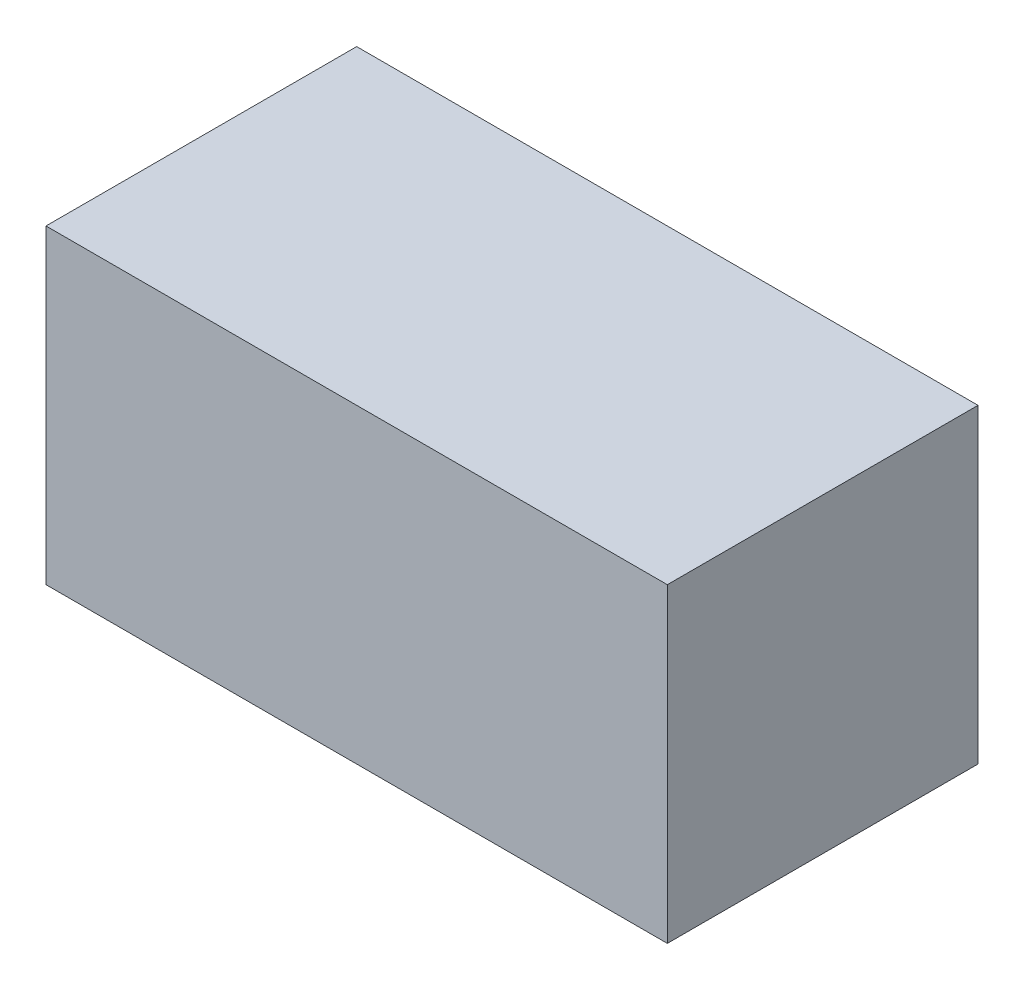
ISO-10303-21;
HEADER;
FILE_DESCRIPTION(('STEP AP214'),'2;1');
FILE_NAME('part.step','',(''),(''),'','','');
FILE_SCHEMA(('AUTOMOTIVE_DESIGN { 1 0 10303 214 1 1 1 1 }'));
ENDSEC;
DATA;
#1=APPLICATION_CONTEXT('core data for automotive mechanical design processes');
#2=APPLICATION_PROTOCOL_DEFINITION('international standard','automotive_design',2000,#1);
#3=PRODUCT_CONTEXT('',#1,'mechanical');
#4=PRODUCT('Part','Part','',(#3));
#5=PRODUCT_RELATED_PRODUCT_CATEGORY('part','',(#4));
#6=PRODUCT_DEFINITION_FORMATION('','',#4);
#7=PRODUCT_DEFINITION_CONTEXT('part definition',#1,'design');
#8=PRODUCT_DEFINITION('design','',#6,#7);
#9=PRODUCT_DEFINITION_SHAPE('','',#8);
#10=(LENGTH_UNIT() NAMED_UNIT(*) SI_UNIT(.MILLI.,.METRE.));
#11=(NAMED_UNIT(*) PLANE_ANGLE_UNIT() SI_UNIT($,.RADIAN.));
#12=(NAMED_UNIT(*) SI_UNIT($,.STERADIAN.) SOLID_ANGLE_UNIT());
#13=UNCERTAINTY_MEASURE_WITH_UNIT(LENGTH_MEASURE(1.E-05),#10,'distance_accuracy_value','');
#14=(GEOMETRIC_REPRESENTATION_CONTEXT(3) GLOBAL_UNCERTAINTY_ASSIGNED_CONTEXT((#13)) GLOBAL_UNIT_ASSIGNED_CONTEXT((#10,
#11,#12)) REPRESENTATION_CONTEXT('',''));
#15=CARTESIAN_POINT('',(0.,0.,0.));
#16=DIRECTION('',(0.,0.,1.));
#17=DIRECTION('',(1.,0.,0.));
#18=AXIS2_PLACEMENT_3D('',#15,#16,#17);
#19=CARTESIAN_POINT('',(2000.,0.,0.));
#20=DIRECTION('',(0.,1.,0.));
#21=DIRECTION('',(0.,0.,1.));
#22=AXIS2_PLACEMENT_3D('',#19,#20,#21);
#23=PLANE('',#22);
#24=DIRECTION('',(0.,0.,-1.));
#25=VECTOR('',#24,1.);
#26=CARTESIAN_POINT('',(0.,0.,0.));
#27=LINE('',#26,#25);
#28=CARTESIAN_POINT('',(0.,0.,0.));
#29=VERTEX_POINT('',#28);
#30=CARTESIAN_POINT('',(0.,1.22464679914735E-13,-1000.));
#31=VERTEX_POINT('',#30);
#32=EDGE_CURVE('E105',#29,#31,#27,.T.);
#33=ORIENTED_EDGE('',*,*,#32,.T.);
#34=DIRECTION('',(-1.,0.,0.));
#35=VECTOR('',#34,1.);
#36=CARTESIAN_POINT('',(2000.,1.22464679914735E-13,-1000.));
#37=LINE('',#36,#35);
#38=CARTESIAN_POINT('',(2000.,1.22464679914735E-13,-1000.));
#39=VERTEX_POINT('',#38);
#40=EDGE_CURVE('E11',#39,#31,#37,.T.);
#41=ORIENTED_EDGE('',*,*,#40,.F.);
#42=DIRECTION('',(0.,0.,-1.));
#43=VECTOR('',#42,1.);
#44=CARTESIAN_POINT('',(2000.,0.,0.));
#45=LINE('',#44,#43);
#46=CARTESIAN_POINT('',(2000.,0.,0.));
#47=VERTEX_POINT('',#46);
#48=EDGE_CURVE('E89',#47,#39,#45,.T.);
#49=ORIENTED_EDGE('',*,*,#48,.F.);
#50=DIRECTION('',(-1.,0.,0.));
#51=VECTOR('',#50,1.);
#52=CARTESIAN_POINT('',(2000.,0.,0.));
#53=LINE('',#52,#51);
#54=EDGE_CURVE('E97',#47,#29,#53,.T.);
#55=ORIENTED_EDGE('',*,*,#54,.T.);
#56=EDGE_LOOP('',(#33,#41,#49,#55));
#57=FACE_BOUND('',#56,.T.);
#58=ADVANCED_FACE('F39',(#57),#23,.F.);
#59=CARTESIAN_POINT('',(2000.,1.22464679914735E-13,-1000.));
#60=DIRECTION('',(0.,0.,1.));
#61=DIRECTION('',(1.,0.,0.));
#62=AXIS2_PLACEMENT_3D('',#59,#60,#61);
#63=PLANE('',#62);
#64=DIRECTION('',(0.,1.,0.));
#65=VECTOR('',#64,1.);
#66=CARTESIAN_POINT('',(0.,1.22464679914735E-13,-1000.));
#67=LINE('',#66,#65);
#68=CARTESIAN_POINT('',(0.,1000.,-1000.));
#69=VERTEX_POINT('',#68);
#70=EDGE_CURVE('E92',#31,#69,#67,.T.);
#71=ORIENTED_EDGE('',*,*,#70,.T.);
#72=DIRECTION('',(-1.,0.,0.));
#73=VECTOR('',#72,1.);
#74=CARTESIAN_POINT('',(2000.,1000.,-1000.));
#75=LINE('',#74,#73);
#76=CARTESIAN_POINT('',(2000.,1000.,-1000.));
#77=VERTEX_POINT('',#76);
#78=EDGE_CURVE('E50',#77,#69,#75,.T.);
#79=ORIENTED_EDGE('',*,*,#78,.F.);
#80=DIRECTION('',(0.,1.,0.));
#81=VECTOR('',#80,1.);
#82=CARTESIAN_POINT('',(2000.,1.22464679914735E-13,-1000.));
#83=LINE('',#82,#81);
#84=EDGE_CURVE('E82',#39,#77,#83,.T.);
#85=ORIENTED_EDGE('',*,*,#84,.F.);
#86=ORIENTED_EDGE('',*,*,#40,.T.);
#87=EDGE_LOOP('',(#71,#79,#85,#86));
#88=FACE_BOUND('',#87,.T.);
#89=ADVANCED_FACE('F93',(#88),#63,.F.);
#90=CARTESIAN_POINT('',(2000.,1000.,0.));
#91=DIRECTION('',(0.,-1.,0.));
#92=DIRECTION('',(0.,0.,-1.));
#93=AXIS2_PLACEMENT_3D('',#90,#91,#92);
#94=PLANE('',#93);
#95=DIRECTION('',(0.,0.,1.));
#96=VECTOR('',#95,1.);
#97=CARTESIAN_POINT('',(0.,1000.,0.));
#98=LINE('',#97,#96);
#99=CARTESIAN_POINT('',(0.,1000.,0.));
#100=VERTEX_POINT('',#99);
#101=EDGE_CURVE('E72',#69,#100,#98,.T.);
#102=ORIENTED_EDGE('',*,*,#101,.T.);
#103=DIRECTION('',(-1.,0.,0.));
#104=VECTOR('',#103,1.);
#105=CARTESIAN_POINT('',(2000.,1000.,0.));
#106=LINE('',#105,#104);
#107=CARTESIAN_POINT('',(2000.,1000.,0.));
#108=VERTEX_POINT('',#107);
#109=EDGE_CURVE('E94',#108,#100,#106,.T.);
#110=ORIENTED_EDGE('',*,*,#109,.F.);
#111=DIRECTION('',(0.,0.,1.));
#112=VECTOR('',#111,1.);
#113=CARTESIAN_POINT('',(2000.,1000.,0.));
#114=LINE('',#113,#112);
#115=EDGE_CURVE('E88',#77,#108,#114,.T.);
#116=ORIENTED_EDGE('',*,*,#115,.F.);
#117=ORIENTED_EDGE('',*,*,#78,.T.);
#118=EDGE_LOOP('',(#102,#110,#116,#117));
#119=FACE_BOUND('',#118,.T.);
#120=ADVANCED_FACE('F96',(#119),#94,.F.);
#121=CARTESIAN_POINT('',(2000.,0.,0.));
#122=DIRECTION('',(0.,0.,-1.));
#123=DIRECTION('',(-1.,0.,0.));
#124=AXIS2_PLACEMENT_3D('',#121,#122,#123);
#125=PLANE('',#124);
#126=DIRECTION('',(0.,-1.,0.));
#127=VECTOR('',#126,1.);
#128=CARTESIAN_POINT('',(0.,0.,0.));
#129=LINE('',#128,#127);
#130=EDGE_CURVE('E76',#100,#29,#129,.T.);
#131=ORIENTED_EDGE('',*,*,#130,.T.);
#132=ORIENTED_EDGE('',*,*,#54,.F.);
#133=DIRECTION('',(0.,-1.,0.));
#134=VECTOR('',#133,1.);
#135=CARTESIAN_POINT('',(2000.,0.,0.));
#136=LINE('',#135,#134);
#137=EDGE_CURVE('E54',#108,#47,#136,.T.);
#138=ORIENTED_EDGE('',*,*,#137,.F.);
#139=ORIENTED_EDGE('',*,*,#109,.T.);
#140=EDGE_LOOP('',(#131,#132,#138,#139));
#141=FACE_BOUND('',#140,.T.);
#142=ADVANCED_FACE('F108',(#141),#125,.F.);
#143=CARTESIAN_POINT('',(2000.,0.,0.));
#144=DIRECTION('',(1.,0.,0.));
#145=DIRECTION('',(0.,0.,-1.));
#146=AXIS2_PLACEMENT_3D('',#143,#144,#145);
#147=PLANE('',#146);
#148=ORIENTED_EDGE('',*,*,#48,.T.);
#149=ORIENTED_EDGE('',*,*,#84,.T.);
#150=ORIENTED_EDGE('',*,*,#115,.T.);
#151=ORIENTED_EDGE('',*,*,#137,.T.);
#152=EDGE_LOOP('',(#148,#149,#150,#151));
#153=FACE_BOUND('',#152,.T.);
#154=ADVANCED_FACE('F86',(#153),#147,.T.);
#155=CARTESIAN_POINT('',(0.,0.,0.));
#156=DIRECTION('',(1.,0.,0.));
#157=DIRECTION('',(0.,0.,-1.));
#158=AXIS2_PLACEMENT_3D('',#155,#156,#157);
#159=PLANE('',#158);
#160=ORIENTED_EDGE('',*,*,#32,.F.);
#161=ORIENTED_EDGE('',*,*,#130,.F.);
#162=ORIENTED_EDGE('',*,*,#101,.F.);
#163=ORIENTED_EDGE('',*,*,#70,.F.);
#164=EDGE_LOOP('',(#160,#161,#162,#163));
#165=FACE_BOUND('',#164,.T.);
#166=ADVANCED_FACE('F115',(#165),#159,.F.);
#167=CLOSED_SHELL('',(#58,#89,#120,#142,#154,#166));
#168=MANIFOLD_SOLID_BREP('B2',#167);
#169=ADVANCED_BREP_SHAPE_REPRESENTATION('',(#18,#168),#14);
#170=SHAPE_DEFINITION_REPRESENTATION(#9,#169);
ENDSEC;
END-ISO-10303-21;
